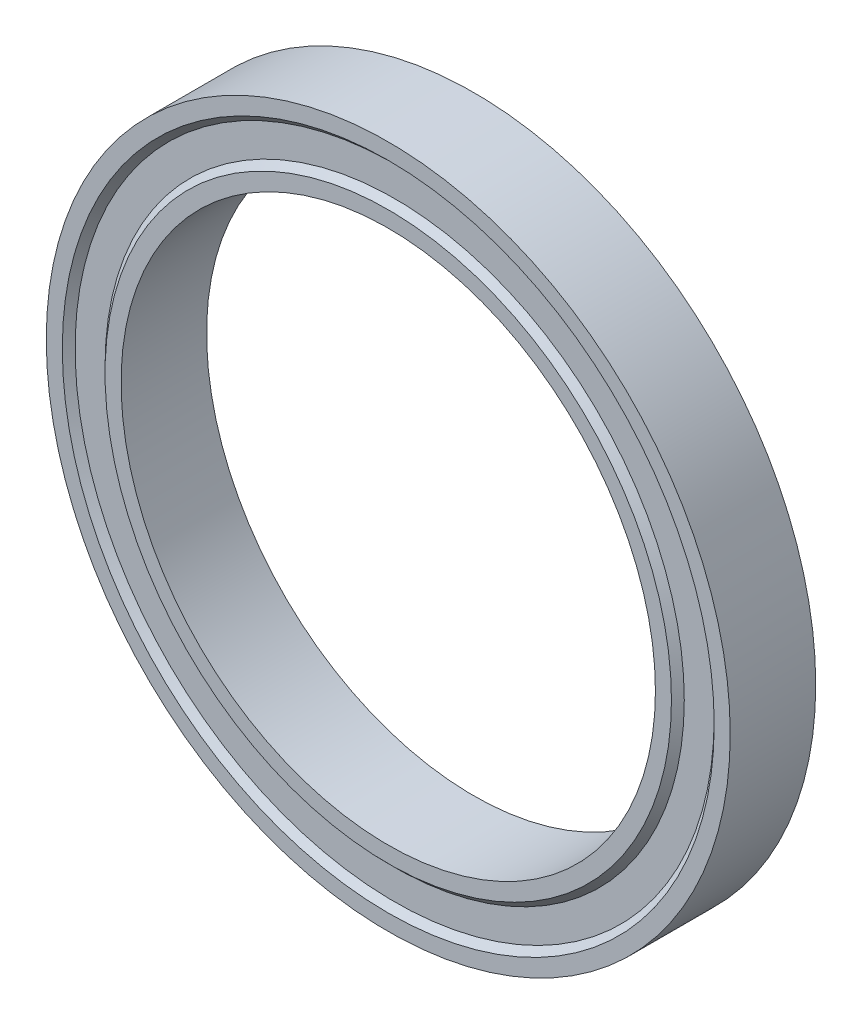
ISO-10303-21;
HEADER;
FILE_DESCRIPTION(('STEP AP214'),'2;1');
FILE_NAME('part.step','',(''),(''),'','','');
FILE_SCHEMA(('AUTOMOTIVE_DESIGN { 1 0 10303 214 1 1 1 1 }'));
ENDSEC;
DATA;
#1=APPLICATION_CONTEXT('core data for automotive mechanical design processes');
#2=APPLICATION_PROTOCOL_DEFINITION('international standard','automotive_design',2000,#1);
#3=PRODUCT_CONTEXT('',#1,'mechanical');
#4=PRODUCT('Part','Part','',(#3));
#5=PRODUCT_RELATED_PRODUCT_CATEGORY('part','',(#4));
#6=PRODUCT_DEFINITION_FORMATION('','',#4);
#7=PRODUCT_DEFINITION_CONTEXT('part definition',#1,'design');
#8=PRODUCT_DEFINITION('design','',#6,#7);
#9=PRODUCT_DEFINITION_SHAPE('','',#8);
#10=(LENGTH_UNIT() NAMED_UNIT(*) SI_UNIT(.MILLI.,.METRE.));
#11=(NAMED_UNIT(*) PLANE_ANGLE_UNIT() SI_UNIT($,.RADIAN.));
#12=(NAMED_UNIT(*) SI_UNIT($,.STERADIAN.) SOLID_ANGLE_UNIT());
#13=UNCERTAINTY_MEASURE_WITH_UNIT(LENGTH_MEASURE(1.E-05),#10,'distance_accuracy_value','');
#14=(GEOMETRIC_REPRESENTATION_CONTEXT(3) GLOBAL_UNCERTAINTY_ASSIGNED_CONTEXT((#13)) GLOBAL_UNIT_ASSIGNED_CONTEXT((#10,
#11,#12)) REPRESENTATION_CONTEXT('',''));
#15=CARTESIAN_POINT('',(0.,0.,0.));
#16=DIRECTION('',(0.,0.,1.));
#17=DIRECTION('',(1.,0.,0.));
#18=AXIS2_PLACEMENT_3D('',#15,#16,#17);
#19=CARTESIAN_POINT('',(0.,0.,0.));
#20=DIRECTION('',(0.,0.,1.));
#21=DIRECTION('',(1.,0.,0.));
#22=AXIS2_PLACEMENT_3D('',#19,#20,#21);
#23=CYLINDRICAL_SURFACE('',#22,12.5);
#24=CARTESIAN_POINT('',(0.,0.,-2.));
#25=DIRECTION('',(0.,0.,1.));
#26=DIRECTION('',(1.,0.,0.));
#27=AXIS2_PLACEMENT_3D('',#24,#25,#26);
#28=CIRCLE('',#27,12.5);
#29=CARTESIAN_POINT('',(12.5,0.,-2.));
#30=VERTEX_POINT('',#29);
#31=EDGE_CURVE('E77',#30,#30,#28,.T.);
#32=ORIENTED_EDGE('',*,*,#31,.F.);
#33=EDGE_LOOP('',(#32));
#34=FACE_BOUND('',#33,.T.);
#35=CARTESIAN_POINT('',(0.,0.,2.));
#36=DIRECTION('',(0.,0.,1.));
#37=DIRECTION('',(1.,0.,0.));
#38=AXIS2_PLACEMENT_3D('',#35,#36,#37);
#39=CIRCLE('',#38,12.5);
#40=CARTESIAN_POINT('',(12.5,0.,2.));
#41=VERTEX_POINT('',#40);
#42=EDGE_CURVE('E10',#41,#41,#39,.T.);
#43=ORIENTED_EDGE('',*,*,#42,.T.);
#44=EDGE_LOOP('',(#43));
#45=FACE_BOUND('',#44,.T.);
#46=ADVANCED_FACE('F37',(#34,#45),#23,.F.);
#47=CARTESIAN_POINT('',(0.,0.,2.));
#48=DIRECTION('',(0.,0.,1.));
#49=DIRECTION('',(1.,0.,0.));
#50=AXIS2_PLACEMENT_3D('',#47,#48,#49);
#51=PLANE('',#50);
#52=CARTESIAN_POINT('',(0.,0.,2.));
#53=DIRECTION('',(0.,0.,1.));
#54=DIRECTION('',(1.,0.,0.));
#55=AXIS2_PLACEMENT_3D('',#52,#53,#54);
#56=CIRCLE('',#55,13.25);
#57=CARTESIAN_POINT('',(13.25,0.,2.));
#58=VERTEX_POINT('',#57);
#59=EDGE_CURVE('E43',#58,#58,#56,.T.);
#60=ORIENTED_EDGE('',*,*,#59,.T.);
#61=EDGE_LOOP('',(#60));
#62=FACE_BOUND('',#61,.T.);
#63=ORIENTED_EDGE('',*,*,#42,.F.);
#64=EDGE_LOOP('',(#63));
#65=FACE_BOUND('',#64,.T.);
#66=ADVANCED_FACE('F84',(#62,#65),#51,.T.);
#67=CARTESIAN_POINT('',(0.,0.,2.));
#68=DIRECTION('',(0.,0.,-1.));
#69=DIRECTION('',(-1.,0.,0.));
#70=AXIS2_PLACEMENT_3D('',#67,#68,#69);
#71=CONICAL_SURFACE('',#70,13.25,0.785398163397446);
#72=CARTESIAN_POINT('',(0.,0.,1.7));
#73=DIRECTION('',(0.,0.,1.));
#74=DIRECTION('',(1.,0.,0.));
#75=AXIS2_PLACEMENT_3D('',#72,#73,#74);
#76=CIRCLE('',#75,13.55);
#77=CARTESIAN_POINT('',(13.55,0.,1.7));
#78=VERTEX_POINT('',#77);
#79=EDGE_CURVE('E47',#78,#78,#76,.T.);
#80=ORIENTED_EDGE('',*,*,#79,.T.);
#81=EDGE_LOOP('',(#80));
#82=FACE_BOUND('',#81,.T.);
#83=ORIENTED_EDGE('',*,*,#59,.F.);
#84=EDGE_LOOP('',(#83));
#85=FACE_BOUND('',#84,.T.);
#86=ADVANCED_FACE('F88',(#82,#85),#71,.T.);
#87=CARTESIAN_POINT('',(0.,0.,1.7));
#88=DIRECTION('',(0.,0.,1.));
#89=DIRECTION('',(1.,0.,0.));
#90=AXIS2_PLACEMENT_3D('',#87,#88,#89);
#91=PLANE('',#90);
#92=CARTESIAN_POINT('',(0.,0.,1.7));
#93=DIRECTION('',(0.,0.,1.));
#94=DIRECTION('',(1.,0.,0.));
#95=AXIS2_PLACEMENT_3D('',#92,#93,#94);
#96=CIRCLE('',#95,14.95);
#97=CARTESIAN_POINT('',(14.95,0.,1.7));
#98=VERTEX_POINT('',#97);
#99=EDGE_CURVE('E51',#98,#98,#96,.T.);
#100=ORIENTED_EDGE('',*,*,#99,.T.);
#101=EDGE_LOOP('',(#100));
#102=FACE_BOUND('',#101,.T.);
#103=ORIENTED_EDGE('',*,*,#79,.F.);
#104=EDGE_LOOP('',(#103));
#105=FACE_BOUND('',#104,.T.);
#106=ADVANCED_FACE('F92',(#102,#105),#91,.T.);
#107=CARTESIAN_POINT('',(0.,0.,1.7));
#108=DIRECTION('',(0.,0.,1.));
#109=DIRECTION('',(1.,0.,0.));
#110=AXIS2_PLACEMENT_3D('',#107,#108,#109);
#111=CONICAL_SURFACE('',#110,14.95,0.785398163397453);
#112=CARTESIAN_POINT('',(0.,0.,2.));
#113=DIRECTION('',(0.,0.,1.));
#114=DIRECTION('',(1.,0.,0.));
#115=AXIS2_PLACEMENT_3D('',#112,#113,#114);
#116=CIRCLE('',#115,15.25);
#117=CARTESIAN_POINT('',(15.25,0.,2.));
#118=VERTEX_POINT('',#117);
#119=EDGE_CURVE('E56',#118,#118,#116,.T.);
#120=ORIENTED_EDGE('',*,*,#119,.T.);
#121=EDGE_LOOP('',(#120));
#122=FACE_BOUND('',#121,.T.);
#123=ORIENTED_EDGE('',*,*,#99,.F.);
#124=EDGE_LOOP('',(#123));
#125=FACE_BOUND('',#124,.T.);
#126=ADVANCED_FACE('F99',(#122,#125),#111,.F.);
#127=CARTESIAN_POINT('',(0.,0.,2.));
#128=DIRECTION('',(0.,0.,1.));
#129=DIRECTION('',(1.,0.,0.));
#130=AXIS2_PLACEMENT_3D('',#127,#128,#129);
#131=PLANE('',#130);
#132=CARTESIAN_POINT('',(0.,0.,2.));
#133=DIRECTION('',(0.,0.,1.));
#134=DIRECTION('',(1.,0.,0.));
#135=AXIS2_PLACEMENT_3D('',#132,#133,#134);
#136=CIRCLE('',#135,16.);
#137=CARTESIAN_POINT('',(16.,0.,2.));
#138=VERTEX_POINT('',#137);
#139=EDGE_CURVE('E59',#138,#138,#136,.T.);
#140=ORIENTED_EDGE('',*,*,#139,.T.);
#141=EDGE_LOOP('',(#140));
#142=FACE_BOUND('',#141,.T.);
#143=ORIENTED_EDGE('',*,*,#119,.F.);
#144=EDGE_LOOP('',(#143));
#145=FACE_BOUND('',#144,.T.);
#146=ADVANCED_FACE('F103',(#142,#145),#131,.T.);
#147=CARTESIAN_POINT('',(0.,0.,0.));
#148=DIRECTION('',(0.,0.,1.));
#149=DIRECTION('',(1.,0.,0.));
#150=AXIS2_PLACEMENT_3D('',#147,#148,#149);
#151=CYLINDRICAL_SURFACE('',#150,16.);
#152=ORIENTED_EDGE('',*,*,#139,.F.);
#153=EDGE_LOOP('',(#152));
#154=FACE_BOUND('',#153,.T.);
#155=CARTESIAN_POINT('',(0.,0.,-2.));
#156=DIRECTION('',(0.,0.,1.));
#157=DIRECTION('',(1.,0.,0.));
#158=AXIS2_PLACEMENT_3D('',#155,#156,#157);
#159=CIRCLE('',#158,16.);
#160=CARTESIAN_POINT('',(16.,0.,-2.));
#161=VERTEX_POINT('',#160);
#162=EDGE_CURVE('E62',#161,#161,#159,.T.);
#163=ORIENTED_EDGE('',*,*,#162,.T.);
#164=EDGE_LOOP('',(#163));
#165=FACE_BOUND('',#164,.T.);
#166=ADVANCED_FACE('F107',(#154,#165),#151,.T.);
#167=CARTESIAN_POINT('',(0.,0.,-2.));
#168=DIRECTION('',(0.,0.,1.));
#169=DIRECTION('',(1.,0.,0.));
#170=AXIS2_PLACEMENT_3D('',#167,#168,#169);
#171=PLANE('',#170);
#172=ORIENTED_EDGE('',*,*,#162,.F.);
#173=EDGE_LOOP('',(#172));
#174=FACE_BOUND('',#173,.T.);
#175=CARTESIAN_POINT('',(0.,0.,-2.));
#176=DIRECTION('',(0.,0.,1.));
#177=DIRECTION('',(1.,0.,0.));
#178=AXIS2_PLACEMENT_3D('',#175,#176,#177);
#179=CIRCLE('',#178,15.25);
#180=CARTESIAN_POINT('',(15.25,0.,-2.));
#181=VERTEX_POINT('',#180);
#182=EDGE_CURVE('E65',#181,#181,#179,.T.);
#183=ORIENTED_EDGE('',*,*,#182,.T.);
#184=EDGE_LOOP('',(#183));
#185=FACE_BOUND('',#184,.T.);
#186=ADVANCED_FACE('F111',(#174,#185),#171,.F.);
#187=CARTESIAN_POINT('',(0.,0.,-1.7));
#188=DIRECTION('',(0.,0.,-1.));
#189=DIRECTION('',(-1.,0.,0.));
#190=AXIS2_PLACEMENT_3D('',#187,#188,#189);
#191=CONICAL_SURFACE('',#190,14.95,0.785398163397456);
#192=ORIENTED_EDGE('',*,*,#182,.F.);
#193=EDGE_LOOP('',(#192));
#194=FACE_BOUND('',#193,.T.);
#195=CARTESIAN_POINT('',(0.,0.,-1.7));
#196=DIRECTION('',(0.,0.,1.));
#197=DIRECTION('',(1.,0.,0.));
#198=AXIS2_PLACEMENT_3D('',#195,#196,#197);
#199=CIRCLE('',#198,14.95);
#200=CARTESIAN_POINT('',(14.95,0.,-1.7));
#201=VERTEX_POINT('',#200);
#202=EDGE_CURVE('E68',#201,#201,#199,.T.);
#203=ORIENTED_EDGE('',*,*,#202,.T.);
#204=EDGE_LOOP('',(#203));
#205=FACE_BOUND('',#204,.T.);
#206=ADVANCED_FACE('F115',(#194,#205),#191,.F.);
#207=CARTESIAN_POINT('',(0.,0.,-1.7));
#208=DIRECTION('',(0.,0.,1.));
#209=DIRECTION('',(1.,0.,0.));
#210=AXIS2_PLACEMENT_3D('',#207,#208,#209);
#211=PLANE('',#210);
#212=ORIENTED_EDGE('',*,*,#202,.F.);
#213=EDGE_LOOP('',(#212));
#214=FACE_BOUND('',#213,.T.);
#215=CARTESIAN_POINT('',(0.,0.,-1.7));
#216=DIRECTION('',(0.,0.,1.));
#217=DIRECTION('',(1.,0.,0.));
#218=AXIS2_PLACEMENT_3D('',#215,#216,#217);
#219=CIRCLE('',#218,13.55);
#220=CARTESIAN_POINT('',(13.55,0.,-1.7));
#221=VERTEX_POINT('',#220);
#222=EDGE_CURVE('E71',#221,#221,#219,.T.);
#223=ORIENTED_EDGE('',*,*,#222,.T.);
#224=EDGE_LOOP('',(#223));
#225=FACE_BOUND('',#224,.T.);
#226=ADVANCED_FACE('F119',(#214,#225),#211,.F.);
#227=CARTESIAN_POINT('',(0.,0.,-2.));
#228=DIRECTION('',(0.,0.,1.));
#229=DIRECTION('',(1.,0.,0.));
#230=AXIS2_PLACEMENT_3D('',#227,#228,#229);
#231=CONICAL_SURFACE('',#230,13.25,0.78539816339745);
#232=ORIENTED_EDGE('',*,*,#222,.F.);
#233=EDGE_LOOP('',(#232));
#234=FACE_BOUND('',#233,.T.);
#235=CARTESIAN_POINT('',(0.,0.,-2.));
#236=DIRECTION('',(0.,0.,1.));
#237=DIRECTION('',(1.,0.,0.));
#238=AXIS2_PLACEMENT_3D('',#235,#236,#237);
#239=CIRCLE('',#238,13.25);
#240=CARTESIAN_POINT('',(13.25,0.,-2.));
#241=VERTEX_POINT('',#240);
#242=EDGE_CURVE('E74',#241,#241,#239,.T.);
#243=ORIENTED_EDGE('',*,*,#242,.T.);
#244=EDGE_LOOP('',(#243));
#245=FACE_BOUND('',#244,.T.);
#246=ADVANCED_FACE('F123',(#234,#245),#231,.T.);
#247=CARTESIAN_POINT('',(0.,0.,-2.));
#248=DIRECTION('',(0.,0.,1.));
#249=DIRECTION('',(1.,0.,0.));
#250=AXIS2_PLACEMENT_3D('',#247,#248,#249);
#251=PLANE('',#250);
#252=ORIENTED_EDGE('',*,*,#242,.F.);
#253=EDGE_LOOP('',(#252));
#254=FACE_BOUND('',#253,.T.);
#255=ORIENTED_EDGE('',*,*,#31,.T.);
#256=EDGE_LOOP('',(#255));
#257=FACE_BOUND('',#256,.T.);
#258=ADVANCED_FACE('F81',(#254,#257),#251,.F.);
#259=CLOSED_SHELL('',(#46,#66,#86,#106,#126,#146,#166,#186,#206,#226,#246,#258));
#260=MANIFOLD_SOLID_BREP('B2',#259);
#261=ADVANCED_BREP_SHAPE_REPRESENTATION('',(#18,#260),#14);
#262=SHAPE_DEFINITION_REPRESENTATION(#9,#261);
ENDSEC;
END-ISO-10303-21;
